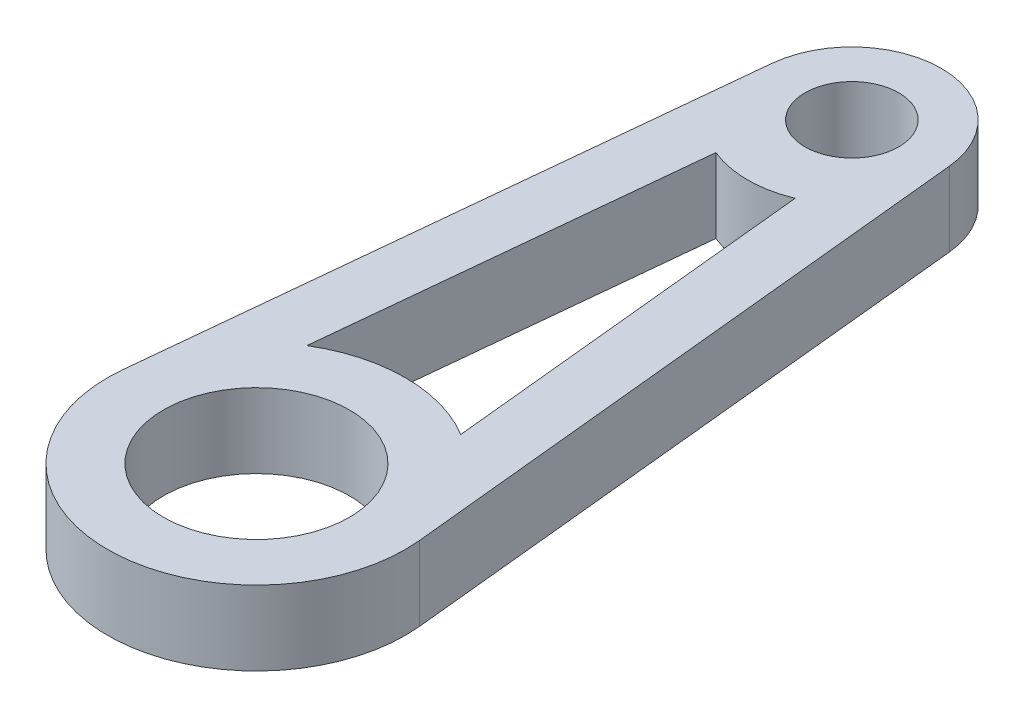
ISO-10303-21;
HEADER;
FILE_DESCRIPTION(('STEP AP214'),'2;1');
FILE_NAME('part.step','',(''),(''),'','','');
FILE_SCHEMA(('AUTOMOTIVE_DESIGN { 1 0 10303 214 1 1 1 1 }'));
ENDSEC;
DATA;
#1=APPLICATION_CONTEXT('core data for automotive mechanical design processes');
#2=APPLICATION_PROTOCOL_DEFINITION('international standard','automotive_design',2000,#1);
#3=PRODUCT_CONTEXT('',#1,'mechanical');
#4=PRODUCT('Part','Part','',(#3));
#5=PRODUCT_RELATED_PRODUCT_CATEGORY('part','',(#4));
#6=PRODUCT_DEFINITION_FORMATION('','',#4);
#7=PRODUCT_DEFINITION_CONTEXT('part definition',#1,'design');
#8=PRODUCT_DEFINITION('design','',#6,#7);
#9=PRODUCT_DEFINITION_SHAPE('','',#8);
#10=(LENGTH_UNIT() NAMED_UNIT(*) SI_UNIT(.MILLI.,.METRE.));
#11=(NAMED_UNIT(*) PLANE_ANGLE_UNIT() SI_UNIT($,.RADIAN.));
#12=(NAMED_UNIT(*) SI_UNIT($,.STERADIAN.) SOLID_ANGLE_UNIT());
#13=UNCERTAINTY_MEASURE_WITH_UNIT(LENGTH_MEASURE(1.E-05),#10,'distance_accuracy_value','');
#14=(GEOMETRIC_REPRESENTATION_CONTEXT(3) GLOBAL_UNCERTAINTY_ASSIGNED_CONTEXT((#13)) GLOBAL_UNIT_ASSIGNED_CONTEXT((#10,
#11,#12)) REPRESENTATION_CONTEXT('',''));
#15=CARTESIAN_POINT('',(0.,0.,0.));
#16=DIRECTION('',(0.,0.,1.));
#17=DIRECTION('',(1.,0.,0.));
#18=AXIS2_PLACEMENT_3D('',#15,#16,#17);
#19=CARTESIAN_POINT('',(0.,-3.175,0.));
#20=DIRECTION('',(0.,1.,0.));
#21=DIRECTION('',(0.,0.,1.));
#22=AXIS2_PLACEMENT_3D('',#19,#20,#21);
#23=CYLINDRICAL_SURFACE('',#22,3.81);
#24=CARTESIAN_POINT('',(0.,0.,0.));
#25=DIRECTION('',(0.,1.,0.));
#26=DIRECTION('',(0.,0.,1.));
#27=AXIS2_PLACEMENT_3D('',#24,#25,#26);
#28=CIRCLE('',#27,3.81);
#29=CARTESIAN_POINT('',(3.79090213537622,0.,-0.381));
#30=VERTEX_POINT('',#29);
#31=CARTESIAN_POINT('',(-3.79090213537622,0.,-0.381));
#32=VERTEX_POINT('',#31);
#33=EDGE_CURVE('E147',#30,#32,#28,.T.);
#34=ORIENTED_EDGE('',*,*,#33,.F.);
#35=DIRECTION('',(0.,1.,0.));
#36=VECTOR('',#35,1.);
#37=CARTESIAN_POINT('',(3.79090213537622,-3.175,-0.381));
#38=LINE('',#37,#36);
#39=CARTESIAN_POINT('',(3.79090213537622,-3.175,-0.381));
#40=VERTEX_POINT('',#39);
#41=EDGE_CURVE('E11',#40,#30,#38,.T.);
#42=ORIENTED_EDGE('',*,*,#41,.F.);
#43=CARTESIAN_POINT('',(0.,-3.175,0.));
#44=DIRECTION('',(0.,1.,0.));
#45=DIRECTION('',(0.,0.,1.));
#46=AXIS2_PLACEMENT_3D('',#43,#44,#45);
#47=CIRCLE('',#46,3.81);
#48=CARTESIAN_POINT('',(-3.79090213537622,-3.175,-0.381));
#49=VERTEX_POINT('',#48);
#50=EDGE_CURVE('E150',#40,#49,#47,.T.);
#51=ORIENTED_EDGE('',*,*,#50,.T.);
#52=DIRECTION('',(0.,1.,0.));
#53=VECTOR('',#52,1.);
#54=CARTESIAN_POINT('',(-3.79090213537622,-3.175,-0.381));
#55=LINE('',#54,#53);
#56=EDGE_CURVE('E39',#49,#32,#55,.T.);
#57=ORIENTED_EDGE('',*,*,#56,.T.);
#58=EDGE_LOOP('',(#34,#42,#51,#57));
#59=FACE_BOUND('',#58,.T.);
#60=ADVANCED_FACE('F36',(#59),#23,.T.);
#61=CARTESIAN_POINT('',(3.79090213537622,-3.175,-0.381));
#62=DIRECTION('',(0.99498743710662,0.,-0.1));
#63=DIRECTION('',(-0.1,0.,-0.99498743710662));
#64=AXIS2_PLACEMENT_3D('',#61,#62,#63);
#65=PLANE('',#64);
#66=DIRECTION('',(-0.1,0.,-0.99498743710662));
#67=VECTOR('',#66,1.);
#68=CARTESIAN_POINT('',(3.79090213537622,0.,-0.381));
#69=LINE('',#68,#67);
#70=CARTESIAN_POINT('',(6.31817022562704,0.,24.765));
#71=VERTEX_POINT('',#70);
#72=EDGE_CURVE('E154',#71,#30,#69,.T.);
#73=ORIENTED_EDGE('',*,*,#72,.F.);
#74=DIRECTION('',(0.,1.,0.));
#75=VECTOR('',#74,1.);
#76=CARTESIAN_POINT('',(6.31817022562704,-3.175,24.765));
#77=LINE('',#76,#75);
#78=CARTESIAN_POINT('',(6.31817022562704,-3.175,24.765));
#79=VERTEX_POINT('',#78);
#80=EDGE_CURVE('E44',#79,#71,#77,.T.);
#81=ORIENTED_EDGE('',*,*,#80,.F.);
#82=DIRECTION('',(-0.1,0.,-0.99498743710662));
#83=VECTOR('',#82,1.);
#84=CARTESIAN_POINT('',(3.79090213537622,-3.175,-0.381));
#85=LINE('',#84,#83);
#86=EDGE_CURVE('E160',#79,#40,#85,.T.);
#87=ORIENTED_EDGE('',*,*,#86,.T.);
#88=ORIENTED_EDGE('',*,*,#41,.T.);
#89=EDGE_LOOP('',(#73,#81,#87,#88));
#90=FACE_BOUND('',#89,.T.);
#91=ADVANCED_FACE('F186',(#90),#65,.T.);
#92=CARTESIAN_POINT('',(0.,-3.175,25.4));
#93=DIRECTION('',(0.,1.,0.));
#94=DIRECTION('',(0.,0.,1.));
#95=AXIS2_PLACEMENT_3D('',#92,#93,#94);
#96=CYLINDRICAL_SURFACE('',#95,6.35);
#97=CARTESIAN_POINT('',(0.,0.,25.4));
#98=DIRECTION('',(0.,1.,0.));
#99=DIRECTION('',(0.,0.,1.));
#100=AXIS2_PLACEMENT_3D('',#97,#98,#99);
#101=CIRCLE('',#100,6.35);
#102=CARTESIAN_POINT('',(-6.31817022562704,0.,24.765));
#103=VERTEX_POINT('',#102);
#104=EDGE_CURVE('E168',#103,#71,#101,.T.);
#105=ORIENTED_EDGE('',*,*,#104,.F.);
#106=DIRECTION('',(0.,1.,0.));
#107=VECTOR('',#106,1.);
#108=CARTESIAN_POINT('',(-6.31817022562704,-3.175,24.765));
#109=LINE('',#108,#107);
#110=CARTESIAN_POINT('',(-6.31817022562704,-3.175,24.765));
#111=VERTEX_POINT('',#110);
#112=EDGE_CURVE('E173',#111,#103,#109,.T.);
#113=ORIENTED_EDGE('',*,*,#112,.F.);
#114=CARTESIAN_POINT('',(0.,-3.175,25.4));
#115=DIRECTION('',(0.,1.,0.));
#116=DIRECTION('',(0.,0.,1.));
#117=AXIS2_PLACEMENT_3D('',#114,#115,#116);
#118=CIRCLE('',#117,6.35);
#119=EDGE_CURVE('E157',#111,#79,#118,.T.);
#120=ORIENTED_EDGE('',*,*,#119,.T.);
#121=ORIENTED_EDGE('',*,*,#80,.T.);
#122=EDGE_LOOP('',(#105,#113,#120,#121));
#123=FACE_BOUND('',#122,.T.);
#124=ADVANCED_FACE('F191',(#123),#96,.T.);
#125=CARTESIAN_POINT('',(-3.79090213537622,-3.175,-0.381));
#126=DIRECTION('',(-0.99498743710662,0.,-0.1));
#127=DIRECTION('',(-0.1,0.,0.99498743710662));
#128=AXIS2_PLACEMENT_3D('',#125,#126,#127);
#129=PLANE('',#128);
#130=DIRECTION('',(-0.1,0.,0.99498743710662));
#131=VECTOR('',#130,1.);
#132=CARTESIAN_POINT('',(-3.79090213537622,0.,-0.381));
#133=LINE('',#132,#131);
#134=EDGE_CURVE('E165',#32,#103,#133,.T.);
#135=ORIENTED_EDGE('',*,*,#134,.F.);
#136=ORIENTED_EDGE('',*,*,#56,.F.);
#137=DIRECTION('',(-0.1,0.,0.99498743710662));
#138=VECTOR('',#137,1.);
#139=CARTESIAN_POINT('',(-3.79090213537622,-3.175,-0.381));
#140=LINE('',#139,#138);
#141=EDGE_CURVE('E153',#49,#111,#140,.T.);
#142=ORIENTED_EDGE('',*,*,#141,.T.);
#143=ORIENTED_EDGE('',*,*,#112,.T.);
#144=EDGE_LOOP('',(#135,#136,#142,#143));
#145=FACE_BOUND('',#144,.T.);
#146=ADVANCED_FACE('F181',(#145),#129,.T.);
#147=CARTESIAN_POINT('',(0.,-3.175,0.));
#148=DIRECTION('',(0.,1.,0.));
#149=DIRECTION('',(0.,0.,1.));
#150=AXIS2_PLACEMENT_3D('',#147,#148,#149);
#151=PLANE('',#150);
#152=DIRECTION('',(-0.1,0.,0.99498743710662));
#153=VECTOR('',#152,1.);
#154=CARTESIAN_POINT('',(-3.28290213537622,-3.175,19.9644638194984));
#155=LINE('',#154,#153);
#156=CARTESIAN_POINT('',(-1.68960499483912,-3.175,4.11135743537517));
#157=VERTEX_POINT('',#156);
#158=CARTESIAN_POINT('',(-3.28290213537622,-3.175,19.9644638194984));
#159=VERTEX_POINT('',#158);
#160=EDGE_CURVE('E109',#157,#159,#155,.T.);
#161=ORIENTED_EDGE('',*,*,#160,.T.);
#162=CARTESIAN_POINT('',(0.,-3.175,25.4));
#163=DIRECTION('',(0.,-1.,0.));
#164=DIRECTION('',(0.,0.,1.));
#165=AXIS2_PLACEMENT_3D('',#162,#163,#164);
#166=CIRCLE('',#165,6.35);
#167=CARTESIAN_POINT('',(3.28290213537622,-3.175,19.9644638194984));
#168=VERTEX_POINT('',#167);
#169=EDGE_CURVE('E103',#159,#168,#166,.T.);
#170=ORIENTED_EDGE('',*,*,#169,.T.);
#171=DIRECTION('',(-0.1,0.,-0.99498743710662));
#172=VECTOR('',#171,1.);
#173=CARTESIAN_POINT('',(3.28290213537622,-3.175,19.9644638194984));
#174=LINE('',#173,#172);
#175=CARTESIAN_POINT('',(1.68960499483911,-3.175,4.11135743537517));
#176=VERTEX_POINT('',#175);
#177=EDGE_CURVE('E112',#168,#176,#174,.T.);
#178=ORIENTED_EDGE('',*,*,#177,.T.);
#179=CARTESIAN_POINT('',(0.,-3.175,0.));
#180=DIRECTION('',(0.,-1.,0.));
#181=DIRECTION('',(0.,0.,-1.));
#182=AXIS2_PLACEMENT_3D('',#179,#180,#181);
#183=CIRCLE('',#182,4.445);
#184=EDGE_CURVE('E52',#176,#157,#183,.T.);
#185=ORIENTED_EDGE('',*,*,#184,.T.);
#186=EDGE_LOOP('',(#161,#170,#178,#185));
#187=FACE_BOUND('',#186,.T.);
#188=CARTESIAN_POINT('',(0.,-3.175,25.4));
#189=DIRECTION('',(0.,1.,0.));
#190=DIRECTION('',(0.,0.,1.));
#191=AXIS2_PLACEMENT_3D('',#188,#189,#190);
#192=CIRCLE('',#191,3.96875);
#193=CARTESIAN_POINT('',(0.,-3.175,29.36875));
#194=VERTEX_POINT('',#193);
#195=EDGE_CURVE('E138',#194,#194,#192,.T.);
#196=ORIENTED_EDGE('',*,*,#195,.T.);
#197=EDGE_LOOP('',(#196));
#198=FACE_BOUND('',#197,.T.);
#199=CARTESIAN_POINT('',(0.,-3.175,0.));
#200=DIRECTION('',(0.,1.,0.));
#201=DIRECTION('',(0.,0.,1.));
#202=AXIS2_PLACEMENT_3D('',#199,#200,#201);
#203=CIRCLE('',#202,2.);
#204=CARTESIAN_POINT('',(0.,-3.175,2.));
#205=VERTEX_POINT('',#204);
#206=EDGE_CURVE('E144',#205,#205,#203,.T.);
#207=ORIENTED_EDGE('',*,*,#206,.T.);
#208=EDGE_LOOP('',(#207));
#209=FACE_BOUND('',#208,.T.);
#210=ORIENTED_EDGE('',*,*,#50,.F.);
#211=ORIENTED_EDGE('',*,*,#86,.F.);
#212=ORIENTED_EDGE('',*,*,#119,.F.);
#213=ORIENTED_EDGE('',*,*,#141,.F.);
#214=EDGE_LOOP('',(#210,#211,#212,#213));
#215=FACE_BOUND('',#214,.T.);
#216=ADVANCED_FACE('F116',(#187,#198,#209,#215),#151,.F.);
#217=CARTESIAN_POINT('',(0.,0.,0.));
#218=DIRECTION('',(0.,1.,0.));
#219=DIRECTION('',(0.,0.,1.));
#220=AXIS2_PLACEMENT_3D('',#217,#218,#219);
#221=PLANE('',#220);
#222=CARTESIAN_POINT('',(0.,0.,25.4));
#223=DIRECTION('',(0.,-1.,0.));
#224=DIRECTION('',(0.,0.,1.));
#225=AXIS2_PLACEMENT_3D('',#222,#223,#224);
#226=CIRCLE('',#225,6.35);
#227=CARTESIAN_POINT('',(-3.28290213537622,0.,19.9644638194984));
#228=VERTEX_POINT('',#227);
#229=CARTESIAN_POINT('',(3.28290213537622,0.,19.9644638194984));
#230=VERTEX_POINT('',#229);
#231=EDGE_CURVE('E60',#228,#230,#226,.T.);
#232=ORIENTED_EDGE('',*,*,#231,.F.);
#233=DIRECTION('',(-0.1,0.,0.99498743710662));
#234=VECTOR('',#233,1.);
#235=CARTESIAN_POINT('',(-3.28290213537622,0.,19.9644638194984));
#236=LINE('',#235,#234);
#237=CARTESIAN_POINT('',(-1.68960499483912,0.,4.11135743537517));
#238=VERTEX_POINT('',#237);
#239=EDGE_CURVE('E119',#238,#228,#236,.T.);
#240=ORIENTED_EDGE('',*,*,#239,.F.);
#241=CARTESIAN_POINT('',(0.,0.,0.));
#242=DIRECTION('',(0.,-1.,0.));
#243=DIRECTION('',(0.,0.,-1.));
#244=AXIS2_PLACEMENT_3D('',#241,#242,#243);
#245=CIRCLE('',#244,4.445);
#246=CARTESIAN_POINT('',(1.68960499483911,0.,4.11135743537517));
#247=VERTEX_POINT('',#246);
#248=EDGE_CURVE('E122',#247,#238,#245,.T.);
#249=ORIENTED_EDGE('',*,*,#248,.F.);
#250=DIRECTION('',(-0.1,0.,-0.99498743710662));
#251=VECTOR('',#250,1.);
#252=CARTESIAN_POINT('',(3.28290213537622,0.,19.9644638194984));
#253=LINE('',#252,#251);
#254=EDGE_CURVE('E128',#230,#247,#253,.T.);
#255=ORIENTED_EDGE('',*,*,#254,.F.);
#256=EDGE_LOOP('',(#232,#240,#249,#255));
#257=FACE_BOUND('',#256,.T.);
#258=CARTESIAN_POINT('',(0.,0.,25.4));
#259=DIRECTION('',(0.,1.,0.));
#260=DIRECTION('',(0.,0.,1.));
#261=AXIS2_PLACEMENT_3D('',#258,#259,#260);
#262=CIRCLE('',#261,3.96875);
#263=CARTESIAN_POINT('',(0.,0.,29.36875));
#264=VERTEX_POINT('',#263);
#265=EDGE_CURVE('E134',#264,#264,#262,.T.);
#266=ORIENTED_EDGE('',*,*,#265,.F.);
#267=EDGE_LOOP('',(#266));
#268=FACE_BOUND('',#267,.T.);
#269=CARTESIAN_POINT('',(0.,0.,0.));
#270=DIRECTION('',(0.,1.,0.));
#271=DIRECTION('',(0.,0.,1.));
#272=AXIS2_PLACEMENT_3D('',#269,#270,#271);
#273=CIRCLE('',#272,2.);
#274=CARTESIAN_POINT('',(0.,0.,2.));
#275=VERTEX_POINT('',#274);
#276=EDGE_CURVE('E141',#275,#275,#273,.T.);
#277=ORIENTED_EDGE('',*,*,#276,.F.);
#278=EDGE_LOOP('',(#277));
#279=FACE_BOUND('',#278,.T.);
#280=ORIENTED_EDGE('',*,*,#33,.T.);
#281=ORIENTED_EDGE('',*,*,#134,.T.);
#282=ORIENTED_EDGE('',*,*,#104,.T.);
#283=ORIENTED_EDGE('',*,*,#72,.T.);
#284=EDGE_LOOP('',(#280,#281,#282,#283));
#285=FACE_BOUND('',#284,.T.);
#286=ADVANCED_FACE('F183',(#257,#268,#279,#285),#221,.T.);
#287=CARTESIAN_POINT('',(0.,-3.175,0.));
#288=DIRECTION('',(0.,1.,0.));
#289=DIRECTION('',(0.,0.,1.));
#290=AXIS2_PLACEMENT_3D('',#287,#288,#289);
#291=CYLINDRICAL_SURFACE('',#290,2.);
#292=ORIENTED_EDGE('',*,*,#206,.F.);
#293=EDGE_LOOP('',(#292));
#294=FACE_BOUND('',#293,.T.);
#295=ORIENTED_EDGE('',*,*,#276,.T.);
#296=EDGE_LOOP('',(#295));
#297=FACE_BOUND('',#296,.T.);
#298=ADVANCED_FACE('F233',(#294,#297),#291,.F.);
#299=CARTESIAN_POINT('',(0.,-3.175,25.4));
#300=DIRECTION('',(0.,1.,0.));
#301=DIRECTION('',(0.,0.,1.));
#302=AXIS2_PLACEMENT_3D('',#299,#300,#301);
#303=CYLINDRICAL_SURFACE('',#302,3.96875);
#304=ORIENTED_EDGE('',*,*,#195,.F.);
#305=EDGE_LOOP('',(#304));
#306=FACE_BOUND('',#305,.T.);
#307=ORIENTED_EDGE('',*,*,#265,.T.);
#308=EDGE_LOOP('',(#307));
#309=FACE_BOUND('',#308,.T.);
#310=ADVANCED_FACE('F243',(#306,#309),#303,.F.);
#311=CARTESIAN_POINT('',(0.,-3.175,25.4));
#312=DIRECTION('',(0.,1.,0.));
#313=DIRECTION('',(0.,0.,1.));
#314=AXIS2_PLACEMENT_3D('',#311,#312,#313);
#315=CYLINDRICAL_SURFACE('',#314,6.35);
#316=ORIENTED_EDGE('',*,*,#231,.T.);
#317=DIRECTION('',(0.,1.,0.));
#318=VECTOR('',#317,1.);
#319=CARTESIAN_POINT('',(3.28290213537622,-3.175,19.9644638194984));
#320=LINE('',#319,#318);
#321=EDGE_CURVE('E99',#168,#230,#320,.T.);
#322=ORIENTED_EDGE('',*,*,#321,.F.);
#323=ORIENTED_EDGE('',*,*,#169,.F.);
#324=DIRECTION('',(0.,1.,0.));
#325=VECTOR('',#324,1.);
#326=CARTESIAN_POINT('',(-3.28290213537622,-3.175,19.9644638194984));
#327=LINE('',#326,#325);
#328=EDGE_CURVE('E132',#159,#228,#327,.T.);
#329=ORIENTED_EDGE('',*,*,#328,.T.);
#330=EDGE_LOOP('',(#316,#322,#323,#329));
#331=FACE_BOUND('',#330,.T.);
#332=ADVANCED_FACE('F101',(#331),#315,.T.);
#333=CARTESIAN_POINT('',(-3.28290213537622,-3.175,19.9644638194984));
#334=DIRECTION('',(-0.99498743710662,0.,-0.1));
#335=DIRECTION('',(-0.1,0.,0.99498743710662));
#336=AXIS2_PLACEMENT_3D('',#333,#334,#335);
#337=PLANE('',#336);
#338=ORIENTED_EDGE('',*,*,#239,.T.);
#339=ORIENTED_EDGE('',*,*,#328,.F.);
#340=ORIENTED_EDGE('',*,*,#160,.F.);
#341=DIRECTION('',(0.,1.,0.));
#342=VECTOR('',#341,1.);
#343=CARTESIAN_POINT('',(-1.68960499483912,-3.175,4.11135743537517));
#344=LINE('',#343,#342);
#345=EDGE_CURVE('E135',#157,#238,#344,.T.);
#346=ORIENTED_EDGE('',*,*,#345,.T.);
#347=EDGE_LOOP('',(#338,#339,#340,#346));
#348=FACE_BOUND('',#347,.T.);
#349=ADVANCED_FACE('F262',(#348),#337,.F.);
#350=CARTESIAN_POINT('',(0.,-3.175,0.));
#351=DIRECTION('',(0.,1.,0.));
#352=DIRECTION('',(0.,0.,1.));
#353=AXIS2_PLACEMENT_3D('',#350,#351,#352);
#354=CYLINDRICAL_SURFACE('',#353,4.445);
#355=ORIENTED_EDGE('',*,*,#248,.T.);
#356=ORIENTED_EDGE('',*,*,#345,.F.);
#357=ORIENTED_EDGE('',*,*,#184,.F.);
#358=DIRECTION('',(0.,1.,0.));
#359=VECTOR('',#358,1.);
#360=CARTESIAN_POINT('',(1.68960499483911,-3.175,4.11135743537517));
#361=LINE('',#360,#359);
#362=EDGE_CURVE('E108',#176,#247,#361,.T.);
#363=ORIENTED_EDGE('',*,*,#362,.T.);
#364=EDGE_LOOP('',(#355,#356,#357,#363));
#365=FACE_BOUND('',#364,.T.);
#366=ADVANCED_FACE('F271',(#365),#354,.T.);
#367=CARTESIAN_POINT('',(3.28290213537622,-3.175,19.9644638194984));
#368=DIRECTION('',(0.99498743710662,0.,-0.1));
#369=DIRECTION('',(-0.1,0.,-0.99498743710662));
#370=AXIS2_PLACEMENT_3D('',#367,#368,#369);
#371=PLANE('',#370);
#372=ORIENTED_EDGE('',*,*,#254,.T.);
#373=ORIENTED_EDGE('',*,*,#362,.F.);
#374=ORIENTED_EDGE('',*,*,#177,.F.);
#375=ORIENTED_EDGE('',*,*,#321,.T.);
#376=EDGE_LOOP('',(#372,#373,#374,#375));
#377=FACE_BOUND('',#376,.T.);
#378=ADVANCED_FACE('F113',(#377),#371,.F.);
#379=CLOSED_SHELL('',(#60,#91,#124,#146,#216,#286,#298,#310,#332,#349,#366,#378));
#380=MANIFOLD_SOLID_BREP('B2',#379);
#381=ADVANCED_BREP_SHAPE_REPRESENTATION('',(#18,#380),#14);
#382=SHAPE_DEFINITION_REPRESENTATION(#9,#381);
ENDSEC;
END-ISO-10303-21;
